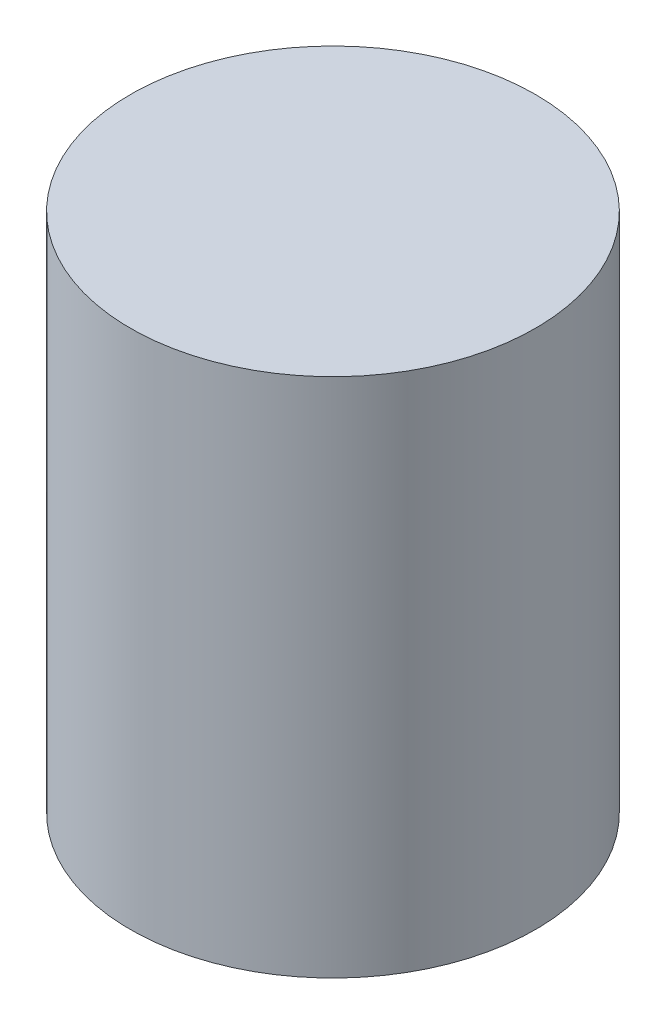
ISO-10303-21;
HEADER;
FILE_DESCRIPTION(('STEP AP214'),'2;1');
FILE_NAME('part.step','',(''),(''),'','','');
FILE_SCHEMA(('AUTOMOTIVE_DESIGN { 1 0 10303 214 1 1 1 1 }'));
ENDSEC;
DATA;
#1=APPLICATION_CONTEXT('core data for automotive mechanical design processes');
#2=APPLICATION_PROTOCOL_DEFINITION('international standard','automotive_design',2000,#1);
#3=PRODUCT_CONTEXT('',#1,'mechanical');
#4=PRODUCT('Part','Part','',(#3));
#5=PRODUCT_RELATED_PRODUCT_CATEGORY('part','',(#4));
#6=PRODUCT_DEFINITION_FORMATION('','',#4);
#7=PRODUCT_DEFINITION_CONTEXT('part definition',#1,'design');
#8=PRODUCT_DEFINITION('design','',#6,#7);
#9=PRODUCT_DEFINITION_SHAPE('','',#8);
#10=(LENGTH_UNIT() NAMED_UNIT(*) SI_UNIT(.MILLI.,.METRE.));
#11=(NAMED_UNIT(*) PLANE_ANGLE_UNIT() SI_UNIT($,.RADIAN.));
#12=(NAMED_UNIT(*) SI_UNIT($,.STERADIAN.) SOLID_ANGLE_UNIT());
#13=UNCERTAINTY_MEASURE_WITH_UNIT(LENGTH_MEASURE(1.E-05),#10,'distance_accuracy_value','');
#14=(GEOMETRIC_REPRESENTATION_CONTEXT(3) GLOBAL_UNCERTAINTY_ASSIGNED_CONTEXT((#13)) GLOBAL_UNIT_ASSIGNED_CONTEXT((#10,
#11,#12)) REPRESENTATION_CONTEXT('',''));
#15=CARTESIAN_POINT('',(0.,0.,0.));
#16=DIRECTION('',(0.,0.,1.));
#17=DIRECTION('',(1.,0.,0.));
#18=AXIS2_PLACEMENT_3D('',#15,#16,#17);
#19=CARTESIAN_POINT('',(0.,180.,0.));
#20=DIRECTION('',(0.,-1.,0.));
#21=DIRECTION('',(0.,0.,-1.));
#22=AXIS2_PLACEMENT_3D('',#19,#20,#21);
#23=CYLINDRICAL_SURFACE('',#22,70.);
#24=CARTESIAN_POINT('',(0.,180.,0.));
#25=DIRECTION('',(0.,1.,0.));
#26=DIRECTION('',(0.,0.,1.));
#27=AXIS2_PLACEMENT_3D('',#24,#25,#26);
#28=CIRCLE('',#27,70.);
#29=CARTESIAN_POINT('',(0.,180.,-70.));
#30=VERTEX_POINT('',#29);
#31=EDGE_CURVE('E10',#30,#30,#28,.T.);
#32=CARTESIAN_POINT('',(0.,0.,0.));
#33=DIRECTION('',(0.,1.,0.));
#34=DIRECTION('',(0.,0.,1.));
#35=AXIS2_PLACEMENT_3D('',#32,#33,#34);
#36=CIRCLE('',#35,70.);
#37=CARTESIAN_POINT('',(0.,0.,-70.));
#38=VERTEX_POINT('',#37);
#39=EDGE_CURVE('E44',#38,#38,#36,.T.);
#40=CARTESIAN_POINT('',(0.,180.,-70.));
#41=CARTESIAN_POINT('',(0.,178.125,-70.));
#42=CARTESIAN_POINT('',(0.,176.25,-70.));
#43=CARTESIAN_POINT('',(0.,172.5,-70.));
#44=CARTESIAN_POINT('',(0.,170.625,-70.));
#45=CARTESIAN_POINT('',(0.,166.875,-70.));
#46=CARTESIAN_POINT('',(0.,165.,-70.));
#47=CARTESIAN_POINT('',(0.,161.25,-70.));
#48=CARTESIAN_POINT('',(0.,159.375,-70.));
#49=CARTESIAN_POINT('',(0.,155.625,-70.));
#50=CARTESIAN_POINT('',(0.,153.75,-70.));
#51=CARTESIAN_POINT('',(0.,150.,-70.));
#52=CARTESIAN_POINT('',(0.,148.125,-70.));
#53=CARTESIAN_POINT('',(0.,144.375,-70.));
#54=CARTESIAN_POINT('',(0.,142.5,-70.));
#55=CARTESIAN_POINT('',(0.,138.75,-70.));
#56=CARTESIAN_POINT('',(0.,136.875,-70.));
#57=CARTESIAN_POINT('',(0.,133.125,-70.));
#58=CARTESIAN_POINT('',(0.,131.25,-70.));
#59=CARTESIAN_POINT('',(0.,127.5,-70.));
#60=CARTESIAN_POINT('',(0.,125.625,-70.));
#61=CARTESIAN_POINT('',(0.,121.875,-70.));
#62=CARTESIAN_POINT('',(0.,120.,-70.));
#63=CARTESIAN_POINT('',(0.,116.25,-70.));
#64=CARTESIAN_POINT('',(0.,114.375,-70.));
#65=CARTESIAN_POINT('',(0.,110.625,-70.));
#66=CARTESIAN_POINT('',(0.,108.75,-70.));
#67=CARTESIAN_POINT('',(0.,105.,-70.));
#68=CARTESIAN_POINT('',(0.,103.125,-70.));
#69=CARTESIAN_POINT('',(0.,99.375,-70.));
#70=CARTESIAN_POINT('',(0.,97.5,-70.));
#71=CARTESIAN_POINT('',(0.,93.75,-70.));
#72=CARTESIAN_POINT('',(0.,91.875,-70.));
#73=CARTESIAN_POINT('',(0.,88.125,-70.));
#74=CARTESIAN_POINT('',(0.,86.25,-70.));
#75=CARTESIAN_POINT('',(0.,82.5,-70.));
#76=CARTESIAN_POINT('',(0.,80.625,-70.));
#77=CARTESIAN_POINT('',(0.,76.875,-70.));
#78=CARTESIAN_POINT('',(0.,75.,-70.));
#79=CARTESIAN_POINT('',(0.,71.25,-70.));
#80=CARTESIAN_POINT('',(0.,69.375,-70.));
#81=CARTESIAN_POINT('',(0.,65.625,-70.));
#82=CARTESIAN_POINT('',(0.,63.75,-70.));
#83=CARTESIAN_POINT('',(0.,60.,-70.));
#84=CARTESIAN_POINT('',(0.,58.125,-70.));
#85=CARTESIAN_POINT('',(0.,54.375,-70.));
#86=CARTESIAN_POINT('',(0.,52.5,-70.));
#87=CARTESIAN_POINT('',(0.,48.75,-70.));
#88=CARTESIAN_POINT('',(0.,46.875,-70.));
#89=CARTESIAN_POINT('',(0.,43.125,-70.));
#90=CARTESIAN_POINT('',(0.,41.25,-70.));
#91=CARTESIAN_POINT('',(0.,37.5,-70.));
#92=CARTESIAN_POINT('',(0.,35.625,-70.));
#93=CARTESIAN_POINT('',(0.,31.875,-70.));
#94=CARTESIAN_POINT('',(0.,30.,-70.));
#95=CARTESIAN_POINT('',(0.,26.25,-70.));
#96=CARTESIAN_POINT('',(0.,24.375,-70.));
#97=CARTESIAN_POINT('',(0.,20.625,-70.));
#98=CARTESIAN_POINT('',(0.,18.75,-70.));
#99=CARTESIAN_POINT('',(0.,15.,-70.));
#100=CARTESIAN_POINT('',(0.,13.125,-70.));
#101=CARTESIAN_POINT('',(0.,9.37499999999998,-70.));
#102=CARTESIAN_POINT('',(0.,7.49999999999997,-70.));
#103=CARTESIAN_POINT('',(0.,3.74999999999997,-70.));
#104=CARTESIAN_POINT('',(0.,1.87499999999997,-70.));
#105=CARTESIAN_POINT('',(0.,0.,-70.));
#106=B_SPLINE_CURVE_WITH_KNOTS('',3,(#40,#41,#42,#43,#44,#45,#46,#47,#48,#49,#50,#51,#52,#53,
#54,#55,#56,#57,#58,#59,#60,#61,#62,#63,#64,#65,#66,#67,#68,#69,#70,#71,#72,#73,#74,#75,#76,#77,
#78,#79,#80,#81,#82,#83,#84,#85,#86,#87,#88,#89,#90,#91,#92,#93,#94,#95,#96,#97,#98,#99,#100,
#101,#102,#103,#104,#105),.UNSPECIFIED.,.F.,.F.,(4,2,2,2,2,2,2,2,2,2,2,2,2,2,2,2,2,2,2,2,2,2,2,
2,2,2,2,2,2,2,2,2,4),(0.,5.62499999999999,11.25,16.875,22.5,28.125,33.75,39.375,45.,50.625,
56.25,61.875,67.5,73.125,78.75,84.375,90.,95.625,101.25,106.875,112.5,118.125,123.75,129.375,
135.,140.625,146.25,151.875,157.5,163.125,168.75,174.375,180.),.UNSPECIFIED.);
#107=EDGE_CURVE('BSEAM41',#30,#38,#106,.T.);
#108=ORIENTED_EDGE('',*,*,#31,.F.);
#109=ORIENTED_EDGE('',*,*,#39,.T.);
#110=ORIENTED_EDGE('',*,*,#107,.T.);
#111=ORIENTED_EDGE('',*,*,#107,.F.);
#112=EDGE_LOOP('',(#108,#110,#109,#111));
#113=FACE_BOUND('',#112,.T.);
#114=ADVANCED_FACE('F41',(#113),#23,.T.);
#115=CARTESIAN_POINT('',(0.,180.,0.));
#116=DIRECTION('',(0.,1.,0.));
#117=DIRECTION('',(0.,0.,1.));
#118=AXIS2_PLACEMENT_3D('',#115,#116,#117);
#119=PLANE('',#118);
#120=ORIENTED_EDGE('',*,*,#31,.T.);
#121=EDGE_LOOP('',(#120));
#122=FACE_BOUND('',#121,.T.);
#123=ADVANCED_FACE('F58',(#122),#119,.T.);
#124=CARTESIAN_POINT('',(0.,0.,0.));
#125=DIRECTION('',(0.,1.,0.));
#126=DIRECTION('',(0.,0.,1.));
#127=AXIS2_PLACEMENT_3D('',#124,#125,#126);
#128=PLANE('',#127);
#129=ORIENTED_EDGE('',*,*,#39,.F.);
#130=EDGE_LOOP('',(#129));
#131=FACE_BOUND('',#130,.T.);
#132=ADVANCED_FACE('F56',(#131),#128,.F.);
#133=CLOSED_SHELL('',(#114,#123,#132));
#134=MANIFOLD_SOLID_BREP('B2',#133);
#135=ADVANCED_BREP_SHAPE_REPRESENTATION('',(#18,#134),#14);
#136=SHAPE_DEFINITION_REPRESENTATION(#9,#135);
ENDSEC;
END-ISO-10303-21;
